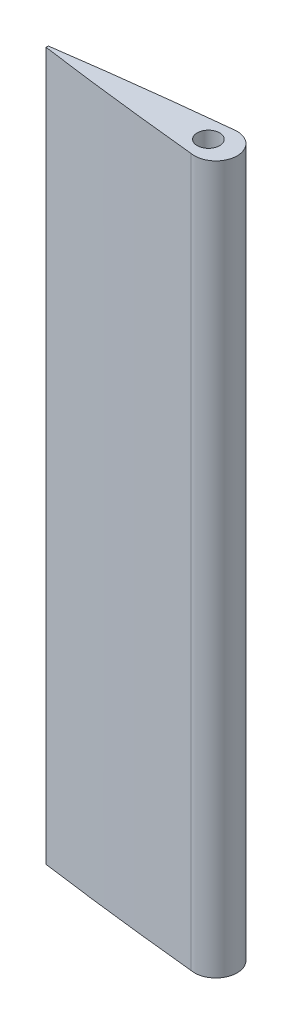
ISO-10303-21;
HEADER;
FILE_DESCRIPTION(('STEP AP214'),'2;1');
FILE_NAME('part.step','',(''),(''),'','','');
FILE_SCHEMA(('AUTOMOTIVE_DESIGN { 1 0 10303 214 1 1 1 1 }'));
ENDSEC;
DATA;
#1=APPLICATION_CONTEXT('core data for automotive mechanical design processes');
#2=APPLICATION_PROTOCOL_DEFINITION('international standard','automotive_design',2000,#1);
#3=PRODUCT_CONTEXT('',#1,'mechanical');
#4=PRODUCT('Part','Part','',(#3));
#5=PRODUCT_RELATED_PRODUCT_CATEGORY('part','',(#4));
#6=PRODUCT_DEFINITION_FORMATION('','',#4);
#7=PRODUCT_DEFINITION_CONTEXT('part definition',#1,'design');
#8=PRODUCT_DEFINITION('design','',#6,#7);
#9=PRODUCT_DEFINITION_SHAPE('','',#8);
#10=(LENGTH_UNIT() NAMED_UNIT(*) SI_UNIT(.MILLI.,.METRE.));
#11=(NAMED_UNIT(*) PLANE_ANGLE_UNIT() SI_UNIT($,.RADIAN.));
#12=(NAMED_UNIT(*) SI_UNIT($,.STERADIAN.) SOLID_ANGLE_UNIT());
#13=UNCERTAINTY_MEASURE_WITH_UNIT(LENGTH_MEASURE(1.E-05),#10,'distance_accuracy_value','');
#14=(GEOMETRIC_REPRESENTATION_CONTEXT(3) GLOBAL_UNCERTAINTY_ASSIGNED_CONTEXT((#13)) GLOBAL_UNIT_ASSIGNED_CONTEXT((#10,
#11,#12)) REPRESENTATION_CONTEXT('',''));
#15=CARTESIAN_POINT('',(0.,0.,0.));
#16=DIRECTION('',(0.,0.,1.));
#17=DIRECTION('',(1.,0.,0.));
#18=AXIS2_PLACEMENT_3D('',#15,#16,#17);
#19=CARTESIAN_POINT('',(0.,190.,0.));
#20=DIRECTION('',(0.,1.,0.));
#21=DIRECTION('',(0.,0.,1.));
#22=AXIS2_PLACEMENT_3D('',#19,#20,#21);
#23=PLANE('',#22);
#24=CARTESIAN_POINT('',(10.364351517666,190.,-0.686445363234236));
#25=DIRECTION('',(0.,1.,0.));
#26=DIRECTION('',(0.,0.,1.));
#27=AXIS2_PLACEMENT_3D('',#24,#25,#26);
#28=CIRCLE('',#27,1.);
#29=CARTESIAN_POINT('',(10.364351517666,190.,0.313554636765766));
#30=VERTEX_POINT('',#29);
#31=EDGE_CURVE('E11',#30,#30,#28,.T.);
#32=ORIENTED_EDGE('',*,*,#31,.T.);
#33=EDGE_LOOP('',(#32));
#34=FACE_BOUND('',#33,.T.);
#35=CARTESIAN_POINT('',(34.0713490991894,190.,-0.686445363234236));
#36=DIRECTION('',(0.,1.,0.));
#37=DIRECTION('',(0.,0.,1.));
#38=AXIS2_PLACEMENT_3D('',#35,#36,#37);
#39=CIRCLE('',#38,0.999999999999998);
#40=CARTESIAN_POINT('',(34.0713490991894,190.,0.313554636765762));
#41=VERTEX_POINT('',#40);
#42=EDGE_CURVE('E55',#41,#41,#39,.T.);
#43=ORIENTED_EDGE('',*,*,#42,.T.);
#44=EDGE_LOOP('',(#43));
#45=FACE_BOUND('',#44,.T.);
#46=DIRECTION('',(7.0098962931437E-07,0.,0.999999999999754));
#47=VECTOR('',#46,1.);
#48=CARTESIAN_POINT('',(-9.09780797356294,190.,-0.883777471889075));
#49=LINE('',#48,#47);
#50=CARTESIAN_POINT('',(-9.09780797127802,190.,-0.883777472212133));
#51=VERTEX_POINT('',#50);
#52=CARTESIAN_POINT('',(-9.09780754001095,190.,-0.265291879737339));
#53=VERTEX_POINT('',#52);
#54=EDGE_CURVE('E109',#51,#53,#49,.T.);
#55=ORIENTED_EDGE('',*,*,#54,.F.);
#56=CARTESIAN_POINT('',(968735.08533982,190.,247625.104847928));
#57=CARTESIAN_POINT('',(-966297.159558536,190.,-258114.314813913));
#58=CARTESIAN_POINT('',(963027.584456695,190.,268979.776906749));
#59=B_SPLINE_CURVE_WITH_KNOTS('',2,(#56,#57,#58),.UNSPECIFIED.,.F.,.F.,(3,3),(0.,1.),.UNSPECIFIED.);
#60=CARTESIAN_POINT('',(35.0713490991895,190.,-6.31254489296174));
#61=VERTEX_POINT('',#60);
#62=EDGE_CURVE('E114',#61,#51,#59,.T.);
#63=ORIENTED_EDGE('',*,*,#62,.F.);
#64=CARTESIAN_POINT('',(36.0713490991894,190.,-0.686445363234236));
#65=DIRECTION('',(0.,1.,0.));
#66=DIRECTION('',(0.,0.,1.));
#67=AXIS2_PLACEMENT_3D('',#64,#65,#66);
#68=CIRCLE('',#67,5.71428);
#69=CARTESIAN_POINT('',(35.0713490991894,190.,4.93965416649326));
#70=VERTEX_POINT('',#69);
#71=EDGE_CURVE('E69',#70,#61,#68,.T.);
#72=ORIENTED_EDGE('',*,*,#71,.F.);
#73=CARTESIAN_POINT('',(961636.924313305,190.,-273912.438107476));
#74=CARTESIAN_POINT('',(-964958.65464866,190.,263071.185208628));
#75=CARTESIAN_POINT('',(967448.922188831,190.,-252605.936221571));
#76=B_SPLINE_CURVE_WITH_KNOTS('',2,(#73,#74,#75),.UNSPECIFIED.,.F.,.F.,(3,3),(0.,1.),.UNSPECIFIED.);
#77=EDGE_CURVE('E47',#53,#70,#76,.T.);
#78=ORIENTED_EDGE('',*,*,#77,.F.);
#79=EDGE_LOOP('',(#55,#63,#72,#78));
#80=FACE_BOUND('',#79,.T.);
#81=ADVANCED_FACE('F44',(#34,#45,#80),#23,.F.);
#82=CARTESIAN_POINT('',(10.364351517666,342.5,-0.686445363234236));
#83=DIRECTION('',(0.,-1.,0.));
#84=DIRECTION('',(0.,0.,-1.));
#85=AXIS2_PLACEMENT_3D('',#82,#83,#84);
#86=CYLINDRICAL_SURFACE('',#85,1.);
#87=ORIENTED_EDGE('',*,*,#31,.F.);
#88=EDGE_LOOP('',(#87));
#89=FACE_BOUND('',#88,.T.);
#90=CARTESIAN_POINT('',(10.364351517666,342.5,-0.686445363234236));
#91=DIRECTION('',(0.,1.,0.));
#92=DIRECTION('',(0.,0.,1.));
#93=AXIS2_PLACEMENT_3D('',#90,#91,#92);
#94=CIRCLE('',#93,1.);
#95=CARTESIAN_POINT('',(10.364351517666,342.5,0.313554636765766));
#96=VERTEX_POINT('',#95);
#97=EDGE_CURVE('E176',#96,#96,#94,.T.);
#98=ORIENTED_EDGE('',*,*,#97,.T.);
#99=EDGE_LOOP('',(#98));
#100=FACE_BOUND('',#99,.T.);
#101=ADVANCED_FACE('F202',(#89,#100),#86,.F.);
#102=CARTESIAN_POINT('',(10.364351517666,342.5,-0.686445363234236));
#103=DIRECTION('',(0.,1.,0.));
#104=DIRECTION('',(0.,0.,1.));
#105=AXIS2_PLACEMENT_3D('',#102,#103,#104);
#106=PLANE('',#105);
#107=ORIENTED_EDGE('',*,*,#97,.F.);
#108=EDGE_LOOP('',(#107));
#109=FACE_BOUND('',#108,.T.);
#110=ADVANCED_FACE('F198',(#109),#106,.F.);
#111=CARTESIAN_POINT('',(34.0713490991894,342.5,-0.686445363234236));
#112=DIRECTION('',(0.,-1.,0.));
#113=DIRECTION('',(0.,0.,-1.));
#114=AXIS2_PLACEMENT_3D('',#111,#112,#113);
#115=CYLINDRICAL_SURFACE('',#114,0.999999999999998);
#116=ORIENTED_EDGE('',*,*,#42,.F.);
#117=EDGE_LOOP('',(#116));
#118=FACE_BOUND('',#117,.T.);
#119=CARTESIAN_POINT('',(34.0713490991894,342.5,-0.686445363234236));
#120=DIRECTION('',(0.,1.,0.));
#121=DIRECTION('',(0.,0.,1.));
#122=AXIS2_PLACEMENT_3D('',#119,#120,#121);
#123=CIRCLE('',#122,0.999999999999998);
#124=CARTESIAN_POINT('',(34.0713490991894,342.5,0.313554636765762));
#125=VERTEX_POINT('',#124);
#126=EDGE_CURVE('E172',#125,#125,#123,.T.);
#127=ORIENTED_EDGE('',*,*,#126,.T.);
#128=EDGE_LOOP('',(#127));
#129=FACE_BOUND('',#128,.T.);
#130=ADVANCED_FACE('F184',(#118,#129),#115,.F.);
#131=CARTESIAN_POINT('',(34.0713490991894,342.5,-0.686445363234236));
#132=DIRECTION('',(0.,1.,0.));
#133=DIRECTION('',(0.,0.,1.));
#134=AXIS2_PLACEMENT_3D('',#131,#132,#133);
#135=PLANE('',#134);
#136=ORIENTED_EDGE('',*,*,#126,.F.);
#137=EDGE_LOOP('',(#136));
#138=FACE_BOUND('',#137,.T.);
#139=ADVANCED_FACE('F186',(#138),#135,.F.);
#140=CARTESIAN_POINT('',(34.0713490991894,375.,-0.686445363234236));
#141=DIRECTION('',(0.,1.,0.));
#142=DIRECTION('',(0.,0.,1.));
#143=AXIS2_PLACEMENT_3D('',#140,#141,#142);
#144=PLANE('',#143);
#145=CARTESIAN_POINT('',(34.0713490991894,375.,-0.686445363234236));
#146=DIRECTION('',(0.,1.,0.));
#147=DIRECTION('',(0.,0.,1.));
#148=AXIS2_PLACEMENT_3D('',#145,#146,#147);
#149=CIRCLE('',#148,2.99999999999999);
#150=CARTESIAN_POINT('',(34.0713490991894,375.,2.31355463676576));
#151=VERTEX_POINT('',#150);
#152=EDGE_CURVE('E105',#151,#151,#149,.T.);
#153=ORIENTED_EDGE('',*,*,#152,.T.);
#154=EDGE_LOOP('',(#153));
#155=FACE_BOUND('',#154,.T.);
#156=ADVANCED_FACE('F188',(#155),#144,.T.);
#157=CARTESIAN_POINT('',(34.0713490991894,375.,-0.686445363234236));
#158=DIRECTION('',(0.,1.,0.));
#159=DIRECTION('',(0.,0.,1.));
#160=AXIS2_PLACEMENT_3D('',#157,#158,#159);
#161=CYLINDRICAL_SURFACE('',#160,2.99999999999999);
#162=ORIENTED_EDGE('',*,*,#152,.F.);
#163=EDGE_LOOP('',(#162));
#164=FACE_BOUND('',#163,.T.);
#165=CARTESIAN_POINT('',(34.0713490991894,380.,-0.686445363234236));
#166=DIRECTION('',(0.,1.,0.));
#167=DIRECTION('',(0.,0.,1.));
#168=AXIS2_PLACEMENT_3D('',#165,#166,#167);
#169=CIRCLE('',#168,2.99999999999999);
#170=CARTESIAN_POINT('',(34.0713490991894,380.,2.31355463676576));
#171=VERTEX_POINT('',#170);
#172=EDGE_CURVE('E165',#171,#171,#169,.T.);
#173=ORIENTED_EDGE('',*,*,#172,.T.);
#174=EDGE_LOOP('',(#173));
#175=FACE_BOUND('',#174,.T.);
#176=ADVANCED_FACE('F159',(#164,#175),#161,.F.);
#177=CARTESIAN_POINT('',(36.0713490991894,380.,-0.686445363234236));
#178=DIRECTION('',(0.,-1.,0.));
#179=DIRECTION('',(0.,0.,-1.));
#180=AXIS2_PLACEMENT_3D('',#177,#178,#179);
#181=CYLINDRICAL_SURFACE('',#180,5.71428);
#182=DIRECTION('',(0.,-1.,0.));
#183=VECTOR('',#182,1.);
#184=CARTESIAN_POINT('',(35.0713490991894,380.,4.93965416649326));
#185=LINE('',#184,#183);
#186=CARTESIAN_POINT('',(35.0713490991894,380.,4.93965416649326));
#187=VERTEX_POINT('',#186);
#188=EDGE_CURVE('E90',#187,#70,#185,.T.);
#189=ORIENTED_EDGE('',*,*,#188,.T.);
#190=ORIENTED_EDGE('',*,*,#71,.T.);
#191=DIRECTION('',(0.,-1.,0.));
#192=VECTOR('',#191,1.);
#193=CARTESIAN_POINT('',(35.0713490991895,380.,-6.31254489296174));
#194=LINE('',#193,#192);
#195=CARTESIAN_POINT('',(35.0713490991895,380.,-6.31254489296174));
#196=VERTEX_POINT('',#195);
#197=EDGE_CURVE('E92',#196,#61,#194,.T.);
#198=ORIENTED_EDGE('',*,*,#197,.F.);
#199=CARTESIAN_POINT('',(36.0713490991894,380.,-0.686445363234236));
#200=DIRECTION('',(0.,1.,0.));
#201=DIRECTION('',(0.,0.,1.));
#202=AXIS2_PLACEMENT_3D('',#199,#200,#201);
#203=CIRCLE('',#202,5.71428);
#204=EDGE_CURVE('E87',#187,#196,#203,.T.);
#205=ORIENTED_EDGE('',*,*,#204,.F.);
#206=EDGE_LOOP('',(#189,#190,#198,#205));
#207=FACE_BOUND('',#206,.T.);
#208=ADVANCED_FACE('F89',(#207),#181,.T.);
#209=CARTESIAN_POINT('',(-207.865698795928,380.,-94.0009779478714));
#210=DIRECTION('',(0.,-1.,0.));
#211=DIRECTION('',(0.,0.,-1.));
#212=AXIS2_PLACEMENT_3D('',#209,#210,#211);
#213=PLANE('',#212);
#214=ORIENTED_EDGE('',*,*,#172,.F.);
#215=EDGE_LOOP('',(#214));
#216=FACE_BOUND('',#215,.T.);
#217=CARTESIAN_POINT('',(961636.924313305,380.,-273912.438107476));
#218=CARTESIAN_POINT('',(-964958.65464866,380.,263071.185208628));
#219=CARTESIAN_POINT('',(967448.922188831,380.,-252605.936221571));
#220=B_SPLINE_CURVE_WITH_KNOTS('',2,(#217,#218,#219),.UNSPECIFIED.,.F.,.F.,(3,3),(0.,1.),.UNSPECIFIED.);
#221=CARTESIAN_POINT('',(-9.09780754001095,380.,-0.265291879737339));
#222=VERTEX_POINT('',#221);
#223=EDGE_CURVE('E97',#222,#187,#220,.T.);
#224=ORIENTED_EDGE('',*,*,#223,.T.);
#225=ORIENTED_EDGE('',*,*,#204,.T.);
#226=CARTESIAN_POINT('',(968735.08533982,380.,247625.104847928));
#227=CARTESIAN_POINT('',(-966297.159558536,380.,-258114.314813913));
#228=CARTESIAN_POINT('',(963027.584456695,380.,268979.776906749));
#229=B_SPLINE_CURVE_WITH_KNOTS('',2,(#226,#227,#228),.UNSPECIFIED.,.F.,.F.,(3,3),(0.,1.),.UNSPECIFIED.);
#230=CARTESIAN_POINT('',(-9.09780797127802,380.,-0.883777472212133));
#231=VERTEX_POINT('',#230);
#232=EDGE_CURVE('E96',#196,#231,#229,.T.);
#233=ORIENTED_EDGE('',*,*,#232,.T.);
#234=DIRECTION('',(7.0098962931437E-07,0.,0.999999999999754));
#235=VECTOR('',#234,1.);
#236=CARTESIAN_POINT('',(-9.09780797356294,380.,-0.883777471889075));
#237=LINE('',#236,#235);
#238=EDGE_CURVE('E102',#231,#222,#237,.T.);
#239=ORIENTED_EDGE('',*,*,#238,.T.);
#240=EDGE_LOOP('',(#224,#225,#233,#239));
#241=FACE_BOUND('',#240,.T.);
#242=ADVANCED_FACE('F100',(#216,#241),#213,.F.);
#243=DIRECTION('',(0.,-1.,0.));
#244=VECTOR('',#243,1.);
#245=SURFACE_OF_LINEAR_EXTRUSION('',#220,#244);
#246=DIRECTION('',(0.,-1.,0.));
#247=VECTOR('',#246,1.);
#248=CARTESIAN_POINT('',(-9.09780754001095,380.,-0.265291879737339));
#249=LINE('',#248,#247);
#250=EDGE_CURVE('E140',#222,#53,#249,.T.);
#251=ORIENTED_EDGE('',*,*,#250,.T.);
#252=ORIENTED_EDGE('',*,*,#77,.T.);
#253=ORIENTED_EDGE('',*,*,#188,.F.);
#254=ORIENTED_EDGE('',*,*,#223,.F.);
#255=EDGE_LOOP('',(#251,#252,#253,#254));
#256=FACE_BOUND('',#255,.T.);
#257=ADVANCED_FACE('F107',(#256),#245,.F.);
#258=DIRECTION('',(0.,-1.,0.));
#259=VECTOR('',#258,1.);
#260=SURFACE_OF_LINEAR_EXTRUSION('',#229,#259);
#261=ORIENTED_EDGE('',*,*,#197,.T.);
#262=ORIENTED_EDGE('',*,*,#62,.T.);
#263=DIRECTION('',(0.,-1.,0.));
#264=VECTOR('',#263,1.);
#265=CARTESIAN_POINT('',(-9.09780797127802,380.,-0.883777472212133));
#266=LINE('',#265,#264);
#267=EDGE_CURVE('E116',#231,#51,#266,.T.);
#268=ORIENTED_EDGE('',*,*,#267,.F.);
#269=ORIENTED_EDGE('',*,*,#232,.F.);
#270=EDGE_LOOP('',(#261,#262,#268,#269));
#271=FACE_BOUND('',#270,.T.);
#272=ADVANCED_FACE('F134',(#271),#260,.F.);
#273=CARTESIAN_POINT('',(-9.09780797356294,380.,-0.883777471889075));
#274=DIRECTION('',(0.999999999999754,0.,-7.0098962931437E-07));
#275=DIRECTION('',(-7.0098962931437E-07,0.,-0.999999999999754));
#276=AXIS2_PLACEMENT_3D('',#273,#274,#275);
#277=PLANE('',#276);
#278=ORIENTED_EDGE('',*,*,#267,.T.);
#279=ORIENTED_EDGE('',*,*,#54,.T.);
#280=ORIENTED_EDGE('',*,*,#250,.F.);
#281=ORIENTED_EDGE('',*,*,#238,.F.);
#282=EDGE_LOOP('',(#278,#279,#280,#281));
#283=FACE_BOUND('',#282,.T.);
#284=ADVANCED_FACE('F138',(#283),#277,.F.);
#285=CLOSED_SHELL('',(#81,#101,#110,#130,#139,#156,#176,#208,#242,#257,#272,#284));
#286=MANIFOLD_SOLID_BREP('B2',#285);
#287=ADVANCED_BREP_SHAPE_REPRESENTATION('',(#18,#286),#14);
#288=SHAPE_DEFINITION_REPRESENTATION(#9,#287);
ENDSEC;
END-ISO-10303-21;
